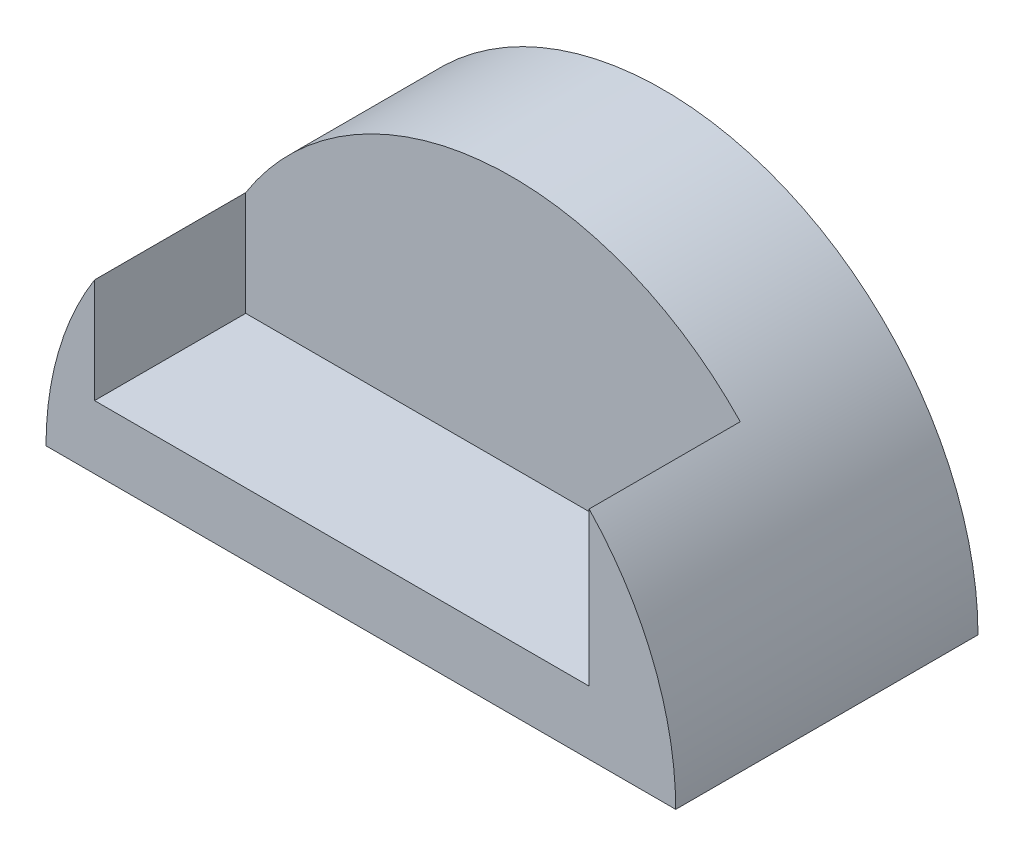
ISO-10303-21;
HEADER;
FILE_DESCRIPTION(('STEP AP214'),'2;1');
FILE_NAME('part.step','',(''),(''),'','','');
FILE_SCHEMA(('AUTOMOTIVE_DESIGN { 1 0 10303 214 1 1 1 1 }'));
ENDSEC;
DATA;
#1=APPLICATION_CONTEXT('core data for automotive mechanical design processes');
#2=APPLICATION_PROTOCOL_DEFINITION('international standard','automotive_design',2000,#1);
#3=PRODUCT_CONTEXT('',#1,'mechanical');
#4=PRODUCT('Part','Part','',(#3));
#5=PRODUCT_RELATED_PRODUCT_CATEGORY('part','',(#4));
#6=PRODUCT_DEFINITION_FORMATION('','',#4);
#7=PRODUCT_DEFINITION_CONTEXT('part definition',#1,'design');
#8=PRODUCT_DEFINITION('design','',#6,#7);
#9=PRODUCT_DEFINITION_SHAPE('','',#8);
#10=(LENGTH_UNIT() NAMED_UNIT(*) SI_UNIT(.MILLI.,.METRE.));
#11=(NAMED_UNIT(*) PLANE_ANGLE_UNIT() SI_UNIT($,.RADIAN.));
#12=(NAMED_UNIT(*) SI_UNIT($,.STERADIAN.) SOLID_ANGLE_UNIT());
#13=UNCERTAINTY_MEASURE_WITH_UNIT(LENGTH_MEASURE(1.E-05),#10,'distance_accuracy_value','');
#14=(GEOMETRIC_REPRESENTATION_CONTEXT(3) GLOBAL_UNCERTAINTY_ASSIGNED_CONTEXT((#13)) GLOBAL_UNIT_ASSIGNED_CONTEXT((#10,
#11,#12)) REPRESENTATION_CONTEXT('',''));
#15=CARTESIAN_POINT('',(0.,0.,0.));
#16=DIRECTION('',(0.,0.,1.));
#17=DIRECTION('',(1.,0.,0.));
#18=AXIS2_PLACEMENT_3D('',#15,#16,#17);
#19=CARTESIAN_POINT('',(0.,0.,7.62));
#20=DIRECTION('',(0.,0.,-1.));
#21=DIRECTION('',(-1.,0.,0.));
#22=AXIS2_PLACEMENT_3D('',#19,#20,#21);
#23=CYLINDRICAL_SURFACE('',#22,15.875);
#24=DIRECTION('',(0.,0.,-1.));
#25=VECTOR('',#24,1.);
#26=CARTESIAN_POINT('',(11.5085573441474,10.9347488702975,7.62));
#27=LINE('',#26,#25);
#28=CARTESIAN_POINT('',(11.5085573441474,10.9347488702975,7.62));
#29=VERTEX_POINT('',#28);
#30=CARTESIAN_POINT('',(11.5085573441474,10.9347488702975,0.));
#31=VERTEX_POINT('',#30);
#32=EDGE_CURVE('E86',#29,#31,#27,.T.);
#33=ORIENTED_EDGE('',*,*,#32,.F.);
#34=CARTESIAN_POINT('',(0.,0.,7.62));
#35=DIRECTION('',(0.,0.,1.));
#36=DIRECTION('',(1.,0.,0.));
#37=AXIS2_PLACEMENT_3D('',#34,#35,#36);
#38=CIRCLE('',#37,15.875);
#39=CARTESIAN_POINT('',(15.875,0.,7.62));
#40=VERTEX_POINT('',#39);
#41=EDGE_CURVE('E84',#40,#29,#38,.T.);
#42=ORIENTED_EDGE('',*,*,#41,.F.);
#43=DIRECTION('',(0.,0.,-1.));
#44=VECTOR('',#43,1.);
#45=CARTESIAN_POINT('',(15.875,0.,7.62));
#46=LINE('',#45,#44);
#47=CARTESIAN_POINT('',(15.875,0.,-7.62));
#48=VERTEX_POINT('',#47);
#49=EDGE_CURVE('E44',#40,#48,#46,.T.);
#50=ORIENTED_EDGE('',*,*,#49,.T.);
#51=CARTESIAN_POINT('',(0.,0.,-7.62));
#52=DIRECTION('',(0.,0.,1.));
#53=DIRECTION('',(1.,0.,0.));
#54=AXIS2_PLACEMENT_3D('',#51,#52,#53);
#55=CIRCLE('',#54,15.875);
#56=CARTESIAN_POINT('',(-15.875,0.,-7.62));
#57=VERTEX_POINT('',#56);
#58=EDGE_CURVE('E80',#48,#57,#55,.T.);
#59=ORIENTED_EDGE('',*,*,#58,.T.);
#60=DIRECTION('',(0.,0.,-1.));
#61=VECTOR('',#60,1.);
#62=CARTESIAN_POINT('',(-15.875,0.,7.62));
#63=LINE('',#62,#61);
#64=CARTESIAN_POINT('',(-15.875,0.,7.62));
#65=VERTEX_POINT('',#64);
#66=EDGE_CURVE('E11',#65,#57,#63,.T.);
#67=ORIENTED_EDGE('',*,*,#66,.F.);
#68=CARTESIAN_POINT('',(-13.4266502348386,8.4699875130551,7.62));
#69=VERTEX_POINT('',#68);
#70=EDGE_CURVE('E79',#69,#65,#38,.T.);
#71=ORIENTED_EDGE('',*,*,#70,.F.);
#72=DIRECTION('',(0.,0.,-1.));
#73=VECTOR('',#72,1.);
#74=CARTESIAN_POINT('',(-13.4266502348386,8.4699875130551,7.62));
#75=LINE('',#74,#73);
#76=CARTESIAN_POINT('',(-13.4266502348386,8.4699875130551,0.));
#77=VERTEX_POINT('',#76);
#78=EDGE_CURVE('E89',#69,#77,#75,.T.);
#79=ORIENTED_EDGE('',*,*,#78,.T.);
#80=CARTESIAN_POINT('',(0.,0.,0.));
#81=DIRECTION('',(0.,0.,1.));
#82=DIRECTION('',(1.,0.,0.));
#83=AXIS2_PLACEMENT_3D('',#80,#81,#82);
#84=CIRCLE('',#83,15.875);
#85=EDGE_CURVE('E109',#31,#77,#84,.T.);
#86=ORIENTED_EDGE('',*,*,#85,.F.);
#87=EDGE_LOOP('',(#33,#42,#50,#59,#67,#71,#79,#86));
#88=FACE_BOUND('',#87,.T.);
#89=ADVANCED_FACE('F37',(#88),#23,.T.);
#90=CARTESIAN_POINT('',(0.,0.,7.62));
#91=DIRECTION('',(0.,0.,1.));
#92=DIRECTION('',(1.,0.,0.));
#93=AXIS2_PLACEMENT_3D('',#90,#91,#92);
#94=PLANE('',#93);
#95=ORIENTED_EDGE('',*,*,#41,.T.);
#96=DIRECTION('',(0.,1.,0.));
#97=VECTOR('',#96,1.);
#98=CARTESIAN_POINT('',(11.5085573441474,0.,7.62));
#99=LINE('',#98,#97);
#100=CARTESIAN_POINT('',(11.5085573441474,3.19868252337671,7.62));
#101=VERTEX_POINT('',#100);
#102=EDGE_CURVE('E105',#101,#29,#99,.T.);
#103=ORIENTED_EDGE('',*,*,#102,.F.);
#104=DIRECTION('',(1.,0.,0.));
#105=VECTOR('',#104,1.);
#106=CARTESIAN_POINT('',(0.,3.19868252337671,7.62));
#107=LINE('',#106,#105);
#108=CARTESIAN_POINT('',(-13.4266502348386,3.19868252337671,7.62));
#109=VERTEX_POINT('',#108);
#110=EDGE_CURVE('E101',#109,#101,#107,.T.);
#111=ORIENTED_EDGE('',*,*,#110,.F.);
#112=DIRECTION('',(0.,1.,0.));
#113=VECTOR('',#112,1.);
#114=CARTESIAN_POINT('',(-13.4266502348386,0.,7.62));
#115=LINE('',#114,#113);
#116=EDGE_CURVE('E51',#109,#69,#115,.T.);
#117=ORIENTED_EDGE('',*,*,#116,.T.);
#118=ORIENTED_EDGE('',*,*,#70,.T.);
#119=DIRECTION('',(1.,0.,0.));
#120=VECTOR('',#119,1.);
#121=CARTESIAN_POINT('',(-15.875,0.,7.62));
#122=LINE('',#121,#120);
#123=EDGE_CURVE('E60',#65,#40,#122,.T.);
#124=ORIENTED_EDGE('',*,*,#123,.T.);
#125=EDGE_LOOP('',(#95,#103,#111,#117,#118,#124));
#126=FACE_BOUND('',#125,.T.);
#127=ADVANCED_FACE('F131',(#126),#94,.T.);
#128=CARTESIAN_POINT('',(-15.875,0.,7.62));
#129=DIRECTION('',(0.,1.,0.));
#130=DIRECTION('',(0.,0.,1.));
#131=AXIS2_PLACEMENT_3D('',#128,#129,#130);
#132=PLANE('',#131);
#133=DIRECTION('',(1.,0.,0.));
#134=VECTOR('',#133,1.);
#135=CARTESIAN_POINT('',(-15.875,0.,-7.62));
#136=LINE('',#135,#134);
#137=EDGE_CURVE('E71',#57,#48,#136,.T.);
#138=ORIENTED_EDGE('',*,*,#137,.T.);
#139=ORIENTED_EDGE('',*,*,#49,.F.);
#140=ORIENTED_EDGE('',*,*,#123,.F.);
#141=ORIENTED_EDGE('',*,*,#66,.T.);
#142=EDGE_LOOP('',(#138,#139,#140,#141));
#143=FACE_BOUND('',#142,.T.);
#144=ADVANCED_FACE('F73',(#143),#132,.F.);
#145=CARTESIAN_POINT('',(0.,0.,-7.62));
#146=DIRECTION('',(0.,0.,1.));
#147=DIRECTION('',(1.,0.,0.));
#148=AXIS2_PLACEMENT_3D('',#145,#146,#147);
#149=PLANE('',#148);
#150=ORIENTED_EDGE('',*,*,#58,.F.);
#151=ORIENTED_EDGE('',*,*,#137,.F.);
#152=EDGE_LOOP('',(#150,#151));
#153=FACE_BOUND('',#152,.T.);
#154=ADVANCED_FACE('F85',(#153),#149,.F.);
#155=CARTESIAN_POINT('',(11.5085573441474,0.,7.62));
#156=DIRECTION('',(-1.,0.,0.));
#157=DIRECTION('',(0.,0.,1.));
#158=AXIS2_PLACEMENT_3D('',#155,#156,#157);
#159=PLANE('',#158);
#160=DIRECTION('',(0.,1.,0.));
#161=VECTOR('',#160,1.);
#162=CARTESIAN_POINT('',(11.5085573441474,0.,0.));
#163=LINE('',#162,#161);
#164=CARTESIAN_POINT('',(11.5085573441474,3.19868252337671,0.));
#165=VERTEX_POINT('',#164);
#166=EDGE_CURVE('E112',#165,#31,#163,.T.);
#167=ORIENTED_EDGE('',*,*,#166,.F.);
#168=DIRECTION('',(0.,0.,-1.));
#169=VECTOR('',#168,1.);
#170=CARTESIAN_POINT('',(11.5085573441474,3.19868252337671,7.62));
#171=LINE('',#170,#169);
#172=EDGE_CURVE('E98',#101,#165,#171,.T.);
#173=ORIENTED_EDGE('',*,*,#172,.F.);
#174=ORIENTED_EDGE('',*,*,#102,.T.);
#175=ORIENTED_EDGE('',*,*,#32,.T.);
#176=EDGE_LOOP('',(#167,#173,#174,#175));
#177=FACE_BOUND('',#176,.T.);
#178=ADVANCED_FACE('F124',(#177),#159,.T.);
#179=CARTESIAN_POINT('',(-13.4266502348386,0.,7.62));
#180=DIRECTION('',(-1.,0.,0.));
#181=DIRECTION('',(0.,0.,1.));
#182=AXIS2_PLACEMENT_3D('',#179,#180,#181);
#183=PLANE('',#182);
#184=DIRECTION('',(0.,1.,0.));
#185=VECTOR('',#184,1.);
#186=CARTESIAN_POINT('',(-13.4266502348386,0.,0.));
#187=LINE('',#186,#185);
#188=CARTESIAN_POINT('',(-13.4266502348386,3.19868252337671,0.));
#189=VERTEX_POINT('',#188);
#190=EDGE_CURVE('E106',#189,#77,#187,.T.);
#191=ORIENTED_EDGE('',*,*,#190,.T.);
#192=ORIENTED_EDGE('',*,*,#78,.F.);
#193=ORIENTED_EDGE('',*,*,#116,.F.);
#194=DIRECTION('',(0.,0.,-1.));
#195=VECTOR('',#194,1.);
#196=CARTESIAN_POINT('',(-13.4266502348386,3.19868252337671,7.62));
#197=LINE('',#196,#195);
#198=EDGE_CURVE('E96',#109,#189,#197,.T.);
#199=ORIENTED_EDGE('',*,*,#198,.T.);
#200=EDGE_LOOP('',(#191,#192,#193,#199));
#201=FACE_BOUND('',#200,.T.);
#202=ADVANCED_FACE('F145',(#201),#183,.F.);
#203=CARTESIAN_POINT('',(0.,3.19868252337671,7.62));
#204=DIRECTION('',(0.,1.,0.));
#205=DIRECTION('',(0.,0.,1.));
#206=AXIS2_PLACEMENT_3D('',#203,#204,#205);
#207=PLANE('',#206);
#208=DIRECTION('',(1.,0.,0.));
#209=VECTOR('',#208,1.);
#210=CARTESIAN_POINT('',(0.,3.19868252337671,0.));
#211=LINE('',#210,#209);
#212=EDGE_CURVE('E102',#189,#165,#211,.T.);
#213=ORIENTED_EDGE('',*,*,#212,.F.);
#214=ORIENTED_EDGE('',*,*,#198,.F.);
#215=ORIENTED_EDGE('',*,*,#110,.T.);
#216=ORIENTED_EDGE('',*,*,#172,.T.);
#217=EDGE_LOOP('',(#213,#214,#215,#216));
#218=FACE_BOUND('',#217,.T.);
#219=ADVANCED_FACE('F149',(#218),#207,.T.);
#220=CARTESIAN_POINT('',(0.,0.,0.));
#221=DIRECTION('',(0.,0.,1.));
#222=DIRECTION('',(1.,0.,0.));
#223=AXIS2_PLACEMENT_3D('',#220,#221,#222);
#224=PLANE('',#223);
#225=ORIENTED_EDGE('',*,*,#166,.T.);
#226=ORIENTED_EDGE('',*,*,#85,.T.);
#227=ORIENTED_EDGE('',*,*,#190,.F.);
#228=ORIENTED_EDGE('',*,*,#212,.T.);
#229=EDGE_LOOP('',(#225,#226,#227,#228));
#230=FACE_BOUND('',#229,.T.);
#231=ADVANCED_FACE('F153',(#230),#224,.T.);
#232=CLOSED_SHELL('',(#89,#127,#144,#154,#178,#202,#219,#231));
#233=MANIFOLD_SOLID_BREP('B2',#232);
#234=ADVANCED_BREP_SHAPE_REPRESENTATION('',(#18,#233),#14);
#235=SHAPE_DEFINITION_REPRESENTATION(#9,#234);
ENDSEC;
END-ISO-10303-21;
